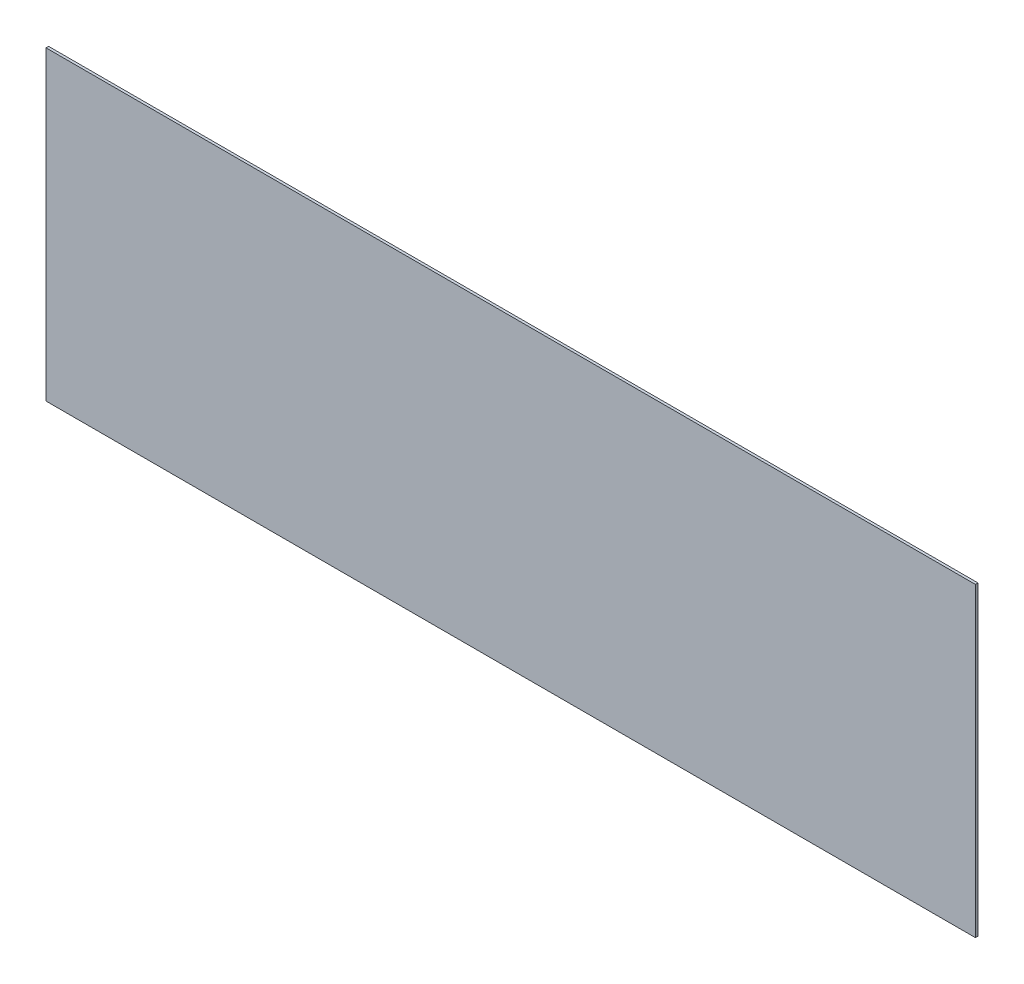
ISO-10303-21;
HEADER;
FILE_DESCRIPTION(('STEP AP214'),'2;1');
FILE_NAME('part.step','',(''),(''),'','','');
FILE_SCHEMA(('AUTOMOTIVE_DESIGN { 1 0 10303 214 1 1 1 1 }'));
ENDSEC;
DATA;
#1=APPLICATION_CONTEXT('core data for automotive mechanical design processes');
#2=APPLICATION_PROTOCOL_DEFINITION('international standard','automotive_design',2000,#1);
#3=PRODUCT_CONTEXT('',#1,'mechanical');
#4=PRODUCT('Part','Part','',(#3));
#5=PRODUCT_RELATED_PRODUCT_CATEGORY('part','',(#4));
#6=PRODUCT_DEFINITION_FORMATION('','',#4);
#7=PRODUCT_DEFINITION_CONTEXT('part definition',#1,'design');
#8=PRODUCT_DEFINITION('design','',#6,#7);
#9=PRODUCT_DEFINITION_SHAPE('','',#8);
#10=(LENGTH_UNIT() NAMED_UNIT(*) SI_UNIT(.MILLI.,.METRE.));
#11=(NAMED_UNIT(*) PLANE_ANGLE_UNIT() SI_UNIT($,.RADIAN.));
#12=(NAMED_UNIT(*) SI_UNIT($,.STERADIAN.) SOLID_ANGLE_UNIT());
#13=UNCERTAINTY_MEASURE_WITH_UNIT(LENGTH_MEASURE(1.E-05),#10,'distance_accuracy_value','');
#14=(GEOMETRIC_REPRESENTATION_CONTEXT(3) GLOBAL_UNCERTAINTY_ASSIGNED_CONTEXT((#13)) GLOBAL_UNIT_ASSIGNED_CONTEXT((#10,
#11,#12)) REPRESENTATION_CONTEXT('',''));
#15=CARTESIAN_POINT('',(0.,0.,0.));
#16=DIRECTION('',(0.,0.,1.));
#17=DIRECTION('',(1.,0.,0.));
#18=AXIS2_PLACEMENT_3D('',#15,#16,#17);
#19=CARTESIAN_POINT('',(-10.0000000000007,156.500000000019,-1.));
#20=DIRECTION('',(1.,0.,0.));
#21=DIRECTION('',(0.,0.,-1.));
#22=AXIS2_PLACEMENT_3D('',#19,#20,#21);
#23=PLANE('',#22);
#24=DIRECTION('',(0.,1.,0.));
#25=VECTOR('',#24,1.);
#26=CARTESIAN_POINT('',(-10.0000000000007,156.500000000019,0.));
#27=LINE('',#26,#25);
#28=CARTESIAN_POINT('',(-10.0000000000007,156.500000000019,0.));
#29=VERTEX_POINT('',#28);
#30=CARTESIAN_POINT('',(-10.0000000000007,274.999999999997,0.));
#31=VERTEX_POINT('',#30);
#32=EDGE_CURVE('E101',#29,#31,#27,.T.);
#33=ORIENTED_EDGE('',*,*,#32,.F.);
#34=DIRECTION('',(0.,0.,1.));
#35=VECTOR('',#34,1.);
#36=CARTESIAN_POINT('',(-10.0000000000007,156.500000000019,-1.));
#37=LINE('',#36,#35);
#38=CARTESIAN_POINT('',(-10.0000000000007,156.500000000019,-1.));
#39=VERTEX_POINT('',#38);
#40=EDGE_CURVE('E11',#39,#29,#37,.T.);
#41=ORIENTED_EDGE('',*,*,#40,.F.);
#42=DIRECTION('',(0.,1.,0.));
#43=VECTOR('',#42,1.);
#44=CARTESIAN_POINT('',(-10.0000000000007,156.500000000019,-1.));
#45=LINE('',#44,#43);
#46=CARTESIAN_POINT('',(-10.0000000000007,274.999999999997,-1.));
#47=VERTEX_POINT('',#46);
#48=EDGE_CURVE('E95',#39,#47,#45,.T.);
#49=ORIENTED_EDGE('',*,*,#48,.T.);
#50=DIRECTION('',(0.,0.,1.));
#51=VECTOR('',#50,1.);
#52=CARTESIAN_POINT('',(-10.0000000000007,274.999999999997,-1.));
#53=LINE('',#52,#51);
#54=EDGE_CURVE('E40',#47,#31,#53,.T.);
#55=ORIENTED_EDGE('',*,*,#54,.T.);
#56=EDGE_LOOP('',(#33,#41,#49,#55));
#57=FACE_BOUND('',#56,.T.);
#58=ADVANCED_FACE('F37',(#57),#23,.T.);
#59=CARTESIAN_POINT('',(-10.0000000000007,156.500000000019,-1.));
#60=DIRECTION('',(0.,-1.,0.));
#61=DIRECTION('',(0.,0.,-1.));
#62=AXIS2_PLACEMENT_3D('',#59,#60,#61);
#63=PLANE('',#62);
#64=DIRECTION('',(1.,0.,0.));
#65=VECTOR('',#64,1.);
#66=CARTESIAN_POINT('',(-10.0000000000007,156.500000000019,0.));
#67=LINE('',#66,#65);
#68=CARTESIAN_POINT('',(-370.,156.500000000019,0.));
#69=VERTEX_POINT('',#68);
#70=EDGE_CURVE('E97',#69,#29,#67,.T.);
#71=ORIENTED_EDGE('',*,*,#70,.F.);
#72=DIRECTION('',(0.,0.,1.));
#73=VECTOR('',#72,1.);
#74=CARTESIAN_POINT('',(-370.,156.500000000019,-1.));
#75=LINE('',#74,#73);
#76=CARTESIAN_POINT('',(-370.,156.500000000019,-1.));
#77=VERTEX_POINT('',#76);
#78=EDGE_CURVE('E46',#77,#69,#75,.T.);
#79=ORIENTED_EDGE('',*,*,#78,.F.);
#80=DIRECTION('',(1.,0.,0.));
#81=VECTOR('',#80,1.);
#82=CARTESIAN_POINT('',(-10.0000000000007,156.500000000019,-1.));
#83=LINE('',#82,#81);
#84=EDGE_CURVE('E92',#77,#39,#83,.T.);
#85=ORIENTED_EDGE('',*,*,#84,.T.);
#86=ORIENTED_EDGE('',*,*,#40,.T.);
#87=EDGE_LOOP('',(#71,#79,#85,#86));
#88=FACE_BOUND('',#87,.T.);
#89=ADVANCED_FACE('F111',(#88),#63,.T.);
#90=CARTESIAN_POINT('',(-370.,156.500000000019,-1.));
#91=DIRECTION('',(-1.,0.,0.));
#92=DIRECTION('',(0.,0.,1.));
#93=AXIS2_PLACEMENT_3D('',#90,#91,#92);
#94=PLANE('',#93);
#95=DIRECTION('',(0.,-1.,0.));
#96=VECTOR('',#95,1.);
#97=CARTESIAN_POINT('',(-370.,156.500000000019,0.));
#98=LINE('',#97,#96);
#99=CARTESIAN_POINT('',(-370.,274.999999999997,0.));
#100=VERTEX_POINT('',#99);
#101=EDGE_CURVE('E87',#100,#69,#98,.T.);
#102=ORIENTED_EDGE('',*,*,#101,.F.);
#103=DIRECTION('',(0.,0.,1.));
#104=VECTOR('',#103,1.);
#105=CARTESIAN_POINT('',(-370.,274.999999999997,-1.));
#106=LINE('',#105,#104);
#107=CARTESIAN_POINT('',(-370.,274.999999999997,-1.));
#108=VERTEX_POINT('',#107);
#109=EDGE_CURVE('E82',#108,#100,#106,.T.);
#110=ORIENTED_EDGE('',*,*,#109,.F.);
#111=DIRECTION('',(0.,-1.,0.));
#112=VECTOR('',#111,1.);
#113=CARTESIAN_POINT('',(-370.,156.500000000019,-1.));
#114=LINE('',#113,#112);
#115=EDGE_CURVE('E85',#108,#77,#114,.T.);
#116=ORIENTED_EDGE('',*,*,#115,.T.);
#117=ORIENTED_EDGE('',*,*,#78,.T.);
#118=EDGE_LOOP('',(#102,#110,#116,#117));
#119=FACE_BOUND('',#118,.T.);
#120=ADVANCED_FACE('F84',(#119),#94,.T.);
#121=CARTESIAN_POINT('',(-10.0000000000007,274.999999999997,-1.));
#122=DIRECTION('',(0.,1.,0.));
#123=DIRECTION('',(0.,0.,1.));
#124=AXIS2_PLACEMENT_3D('',#121,#122,#123);
#125=PLANE('',#124);
#126=DIRECTION('',(-1.,0.,0.));
#127=VECTOR('',#126,1.);
#128=CARTESIAN_POINT('',(-10.0000000000007,274.999999999997,0.));
#129=LINE('',#128,#127);
#130=EDGE_CURVE('E104',#31,#100,#129,.T.);
#131=ORIENTED_EDGE('',*,*,#130,.F.);
#132=ORIENTED_EDGE('',*,*,#54,.F.);
#133=DIRECTION('',(-1.,0.,0.));
#134=VECTOR('',#133,1.);
#135=CARTESIAN_POINT('',(-10.0000000000007,274.999999999997,-1.));
#136=LINE('',#135,#134);
#137=EDGE_CURVE('E91',#47,#108,#136,.T.);
#138=ORIENTED_EDGE('',*,*,#137,.T.);
#139=ORIENTED_EDGE('',*,*,#109,.T.);
#140=EDGE_LOOP('',(#131,#132,#138,#139));
#141=FACE_BOUND('',#140,.T.);
#142=ADVANCED_FACE('F94',(#141),#125,.T.);
#143=CARTESIAN_POINT('',(0.,0.,-1.));
#144=DIRECTION('',(0.,0.,1.));
#145=DIRECTION('',(1.,0.,0.));
#146=AXIS2_PLACEMENT_3D('',#143,#144,#145);
#147=PLANE('',#146);
#148=ORIENTED_EDGE('',*,*,#48,.F.);
#149=ORIENTED_EDGE('',*,*,#84,.F.);
#150=ORIENTED_EDGE('',*,*,#115,.F.);
#151=ORIENTED_EDGE('',*,*,#137,.F.);
#152=EDGE_LOOP('',(#148,#149,#150,#151));
#153=FACE_BOUND('',#152,.T.);
#154=ADVANCED_FACE('F90',(#153),#147,.F.);
#155=CARTESIAN_POINT('',(0.,0.,0.));
#156=DIRECTION('',(0.,0.,1.));
#157=DIRECTION('',(1.,0.,0.));
#158=AXIS2_PLACEMENT_3D('',#155,#156,#157);
#159=PLANE('',#158);
#160=ORIENTED_EDGE('',*,*,#32,.T.);
#161=ORIENTED_EDGE('',*,*,#130,.T.);
#162=ORIENTED_EDGE('',*,*,#101,.T.);
#163=ORIENTED_EDGE('',*,*,#70,.T.);
#164=EDGE_LOOP('',(#160,#161,#162,#163));
#165=FACE_BOUND('',#164,.T.);
#166=ADVANCED_FACE('F110',(#165),#159,.T.);
#167=CLOSED_SHELL('',(#58,#89,#120,#142,#154,#166));
#168=MANIFOLD_SOLID_BREP('B2',#167);
#169=ADVANCED_BREP_SHAPE_REPRESENTATION('',(#18,#168),#14);
#170=SHAPE_DEFINITION_REPRESENTATION(#9,#169);
ENDSEC;
END-ISO-10303-21;
